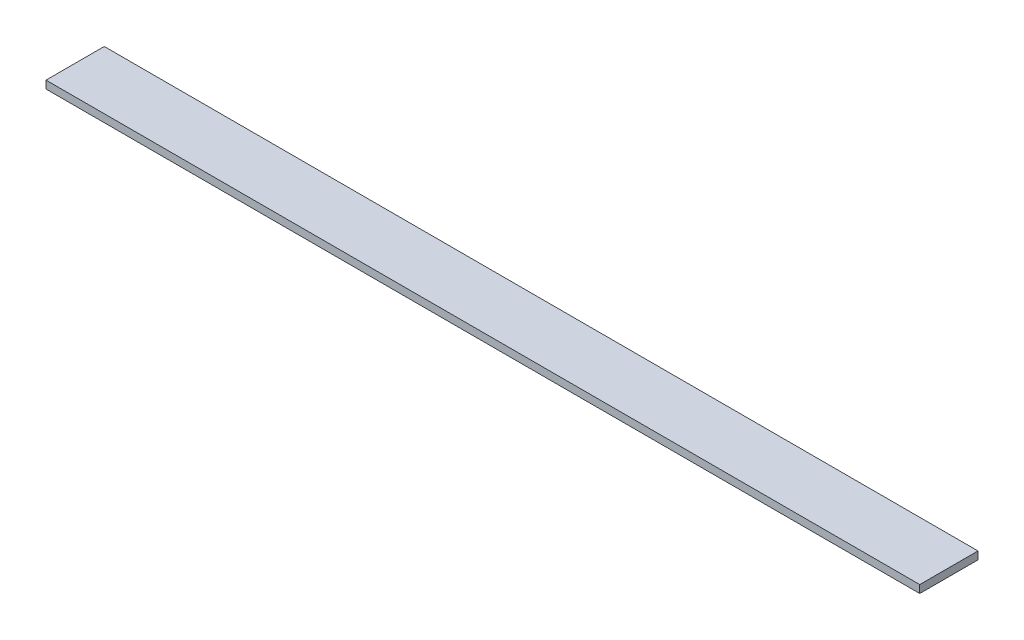
ISO-10303-21;
HEADER;
FILE_DESCRIPTION(('STEP AP214'),'2;1');
FILE_NAME('part.step','',(''),(''),'','','');
FILE_SCHEMA(('AUTOMOTIVE_DESIGN { 1 0 10303 214 1 1 1 1 }'));
ENDSEC;
DATA;
#1=APPLICATION_CONTEXT('core data for automotive mechanical design processes');
#2=APPLICATION_PROTOCOL_DEFINITION('international standard','automotive_design',2000,#1);
#3=PRODUCT_CONTEXT('',#1,'mechanical');
#4=PRODUCT('Part','Part','',(#3));
#5=PRODUCT_RELATED_PRODUCT_CATEGORY('part','',(#4));
#6=PRODUCT_DEFINITION_FORMATION('','',#4);
#7=PRODUCT_DEFINITION_CONTEXT('part definition',#1,'design');
#8=PRODUCT_DEFINITION('design','',#6,#7);
#9=PRODUCT_DEFINITION_SHAPE('','',#8);
#10=(LENGTH_UNIT() NAMED_UNIT(*) SI_UNIT(.MILLI.,.METRE.));
#11=(NAMED_UNIT(*) PLANE_ANGLE_UNIT() SI_UNIT($,.RADIAN.));
#12=(NAMED_UNIT(*) SI_UNIT($,.STERADIAN.) SOLID_ANGLE_UNIT());
#13=UNCERTAINTY_MEASURE_WITH_UNIT(LENGTH_MEASURE(1.E-05),#10,'distance_accuracy_value','');
#14=(GEOMETRIC_REPRESENTATION_CONTEXT(3) GLOBAL_UNCERTAINTY_ASSIGNED_CONTEXT((#13)) GLOBAL_UNIT_ASSIGNED_CONTEXT((#10,
#11,#12)) REPRESENTATION_CONTEXT('',''));
#15=CARTESIAN_POINT('',(0.,0.,0.));
#16=DIRECTION('',(0.,0.,1.));
#17=DIRECTION('',(1.,0.,0.));
#18=AXIS2_PLACEMENT_3D('',#15,#16,#17);
#19=CARTESIAN_POINT('',(0.,4.,-30.));
#20=DIRECTION('',(1.,0.,0.));
#21=DIRECTION('',(0.,0.,-1.));
#22=AXIS2_PLACEMENT_3D('',#19,#20,#21);
#23=PLANE('',#22);
#24=DIRECTION('',(0.,0.,1.));
#25=VECTOR('',#24,1.);
#26=CARTESIAN_POINT('',(0.,0.,-30.));
#27=LINE('',#26,#25);
#28=CARTESIAN_POINT('',(0.,0.,-30.));
#29=VERTEX_POINT('',#28);
#30=CARTESIAN_POINT('',(0.,0.,0.));
#31=VERTEX_POINT('',#30);
#32=EDGE_CURVE('E96',#29,#31,#27,.T.);
#33=ORIENTED_EDGE('',*,*,#32,.T.);
#34=DIRECTION('',(0.,-1.,0.));
#35=VECTOR('',#34,1.);
#36=CARTESIAN_POINT('',(0.,4.,0.));
#37=LINE('',#36,#35);
#38=CARTESIAN_POINT('',(0.,4.,0.));
#39=VERTEX_POINT('',#38);
#40=EDGE_CURVE('E11',#39,#31,#37,.T.);
#41=ORIENTED_EDGE('',*,*,#40,.F.);
#42=DIRECTION('',(0.,0.,1.));
#43=VECTOR('',#42,1.);
#44=CARTESIAN_POINT('',(0.,4.,-30.));
#45=LINE('',#44,#43);
#46=CARTESIAN_POINT('',(0.,4.,-30.));
#47=VERTEX_POINT('',#46);
#48=EDGE_CURVE('E84',#47,#39,#45,.T.);
#49=ORIENTED_EDGE('',*,*,#48,.F.);
#50=DIRECTION('',(0.,-1.,0.));
#51=VECTOR('',#50,1.);
#52=CARTESIAN_POINT('',(0.,4.,-30.));
#53=LINE('',#52,#51);
#54=EDGE_CURVE('E92',#47,#29,#53,.T.);
#55=ORIENTED_EDGE('',*,*,#54,.T.);
#56=EDGE_LOOP('',(#33,#41,#49,#55));
#57=FACE_BOUND('',#56,.T.);
#58=ADVANCED_FACE('F33',(#57),#23,.F.);
#59=CARTESIAN_POINT('',(0.,4.,0.));
#60=DIRECTION('',(0.,0.,-1.));
#61=DIRECTION('',(-1.,0.,0.));
#62=AXIS2_PLACEMENT_3D('',#59,#60,#61);
#63=PLANE('',#62);
#64=DIRECTION('',(1.,0.,0.));
#65=VECTOR('',#64,1.);
#66=CARTESIAN_POINT('',(0.,0.,0.));
#67=LINE('',#66,#65);
#68=CARTESIAN_POINT('',(450.,0.,0.));
#69=VERTEX_POINT('',#68);
#70=EDGE_CURVE('E88',#31,#69,#67,.T.);
#71=ORIENTED_EDGE('',*,*,#70,.T.);
#72=DIRECTION('',(0.,-1.,0.));
#73=VECTOR('',#72,1.);
#74=CARTESIAN_POINT('',(450.,4.,0.));
#75=LINE('',#74,#73);
#76=CARTESIAN_POINT('',(450.,4.,0.));
#77=VERTEX_POINT('',#76);
#78=EDGE_CURVE('E41',#77,#69,#75,.T.);
#79=ORIENTED_EDGE('',*,*,#78,.F.);
#80=DIRECTION('',(1.,0.,0.));
#81=VECTOR('',#80,1.);
#82=CARTESIAN_POINT('',(0.,4.,0.));
#83=LINE('',#82,#81);
#84=EDGE_CURVE('E79',#39,#77,#83,.T.);
#85=ORIENTED_EDGE('',*,*,#84,.F.);
#86=ORIENTED_EDGE('',*,*,#40,.T.);
#87=EDGE_LOOP('',(#71,#79,#85,#86));
#88=FACE_BOUND('',#87,.T.);
#89=ADVANCED_FACE('F87',(#88),#63,.F.);
#90=CARTESIAN_POINT('',(450.,4.,0.));
#91=DIRECTION('',(-1.,0.,0.));
#92=DIRECTION('',(0.,0.,1.));
#93=AXIS2_PLACEMENT_3D('',#90,#91,#92);
#94=PLANE('',#93);
#95=DIRECTION('',(0.,0.,-1.));
#96=VECTOR('',#95,1.);
#97=CARTESIAN_POINT('',(450.,0.,0.));
#98=LINE('',#97,#96);
#99=CARTESIAN_POINT('',(450.,0.,-30.0000000000001));
#100=VERTEX_POINT('',#99);
#101=EDGE_CURVE('E66',#69,#100,#98,.T.);
#102=ORIENTED_EDGE('',*,*,#101,.T.);
#103=DIRECTION('',(0.,-1.,0.));
#104=VECTOR('',#103,1.);
#105=CARTESIAN_POINT('',(450.,4.,-30.0000000000001));
#106=LINE('',#105,#104);
#107=CARTESIAN_POINT('',(450.,4.,-30.0000000000001));
#108=VERTEX_POINT('',#107);
#109=EDGE_CURVE('E89',#108,#100,#106,.T.);
#110=ORIENTED_EDGE('',*,*,#109,.F.);
#111=DIRECTION('',(0.,0.,-1.));
#112=VECTOR('',#111,1.);
#113=CARTESIAN_POINT('',(450.,4.,0.));
#114=LINE('',#113,#112);
#115=EDGE_CURVE('E82',#77,#108,#114,.T.);
#116=ORIENTED_EDGE('',*,*,#115,.F.);
#117=ORIENTED_EDGE('',*,*,#78,.T.);
#118=EDGE_LOOP('',(#102,#110,#116,#117));
#119=FACE_BOUND('',#118,.T.);
#120=ADVANCED_FACE('F90',(#119),#94,.F.);
#121=CARTESIAN_POINT('',(450.,4.,-30.0000000000001));
#122=DIRECTION('',(0.,0.,1.));
#123=DIRECTION('',(1.,0.,0.));
#124=AXIS2_PLACEMENT_3D('',#121,#122,#123);
#125=PLANE('',#124);
#126=DIRECTION('',(-1.,0.,0.));
#127=VECTOR('',#126,1.);
#128=CARTESIAN_POINT('',(450.,0.,-30.0000000000001));
#129=LINE('',#128,#127);
#130=EDGE_CURVE('E72',#100,#29,#129,.T.);
#131=ORIENTED_EDGE('',*,*,#130,.T.);
#132=ORIENTED_EDGE('',*,*,#54,.F.);
#133=DIRECTION('',(-1.,0.,0.));
#134=VECTOR('',#133,1.);
#135=CARTESIAN_POINT('',(450.,4.,-30.0000000000001));
#136=LINE('',#135,#134);
#137=EDGE_CURVE('E49',#108,#47,#136,.T.);
#138=ORIENTED_EDGE('',*,*,#137,.F.);
#139=ORIENTED_EDGE('',*,*,#109,.T.);
#140=EDGE_LOOP('',(#131,#132,#138,#139));
#141=FACE_BOUND('',#140,.T.);
#142=ADVANCED_FACE('F103',(#141),#125,.F.);
#143=CARTESIAN_POINT('',(0.,4.,0.));
#144=DIRECTION('',(0.,1.,0.));
#145=DIRECTION('',(0.,0.,1.));
#146=AXIS2_PLACEMENT_3D('',#143,#144,#145);
#147=PLANE('',#146);
#148=ORIENTED_EDGE('',*,*,#48,.T.);
#149=ORIENTED_EDGE('',*,*,#84,.T.);
#150=ORIENTED_EDGE('',*,*,#115,.T.);
#151=ORIENTED_EDGE('',*,*,#137,.T.);
#152=EDGE_LOOP('',(#148,#149,#150,#151));
#153=FACE_BOUND('',#152,.T.);
#154=ADVANCED_FACE('F80',(#153),#147,.T.);
#155=CARTESIAN_POINT('',(0.,0.,0.));
#156=DIRECTION('',(0.,1.,0.));
#157=DIRECTION('',(0.,0.,1.));
#158=AXIS2_PLACEMENT_3D('',#155,#156,#157);
#159=PLANE('',#158);
#160=ORIENTED_EDGE('',*,*,#32,.F.);
#161=ORIENTED_EDGE('',*,*,#130,.F.);
#162=ORIENTED_EDGE('',*,*,#101,.F.);
#163=ORIENTED_EDGE('',*,*,#70,.F.);
#164=EDGE_LOOP('',(#160,#161,#162,#163));
#165=FACE_BOUND('',#164,.T.);
#166=ADVANCED_FACE('F106',(#165),#159,.F.);
#167=CLOSED_SHELL('',(#58,#89,#120,#142,#154,#166));
#168=MANIFOLD_SOLID_BREP('B2',#167);
#169=ADVANCED_BREP_SHAPE_REPRESENTATION('',(#18,#168),#14);
#170=SHAPE_DEFINITION_REPRESENTATION(#9,#169);
ENDSEC;
END-ISO-10303-21;
